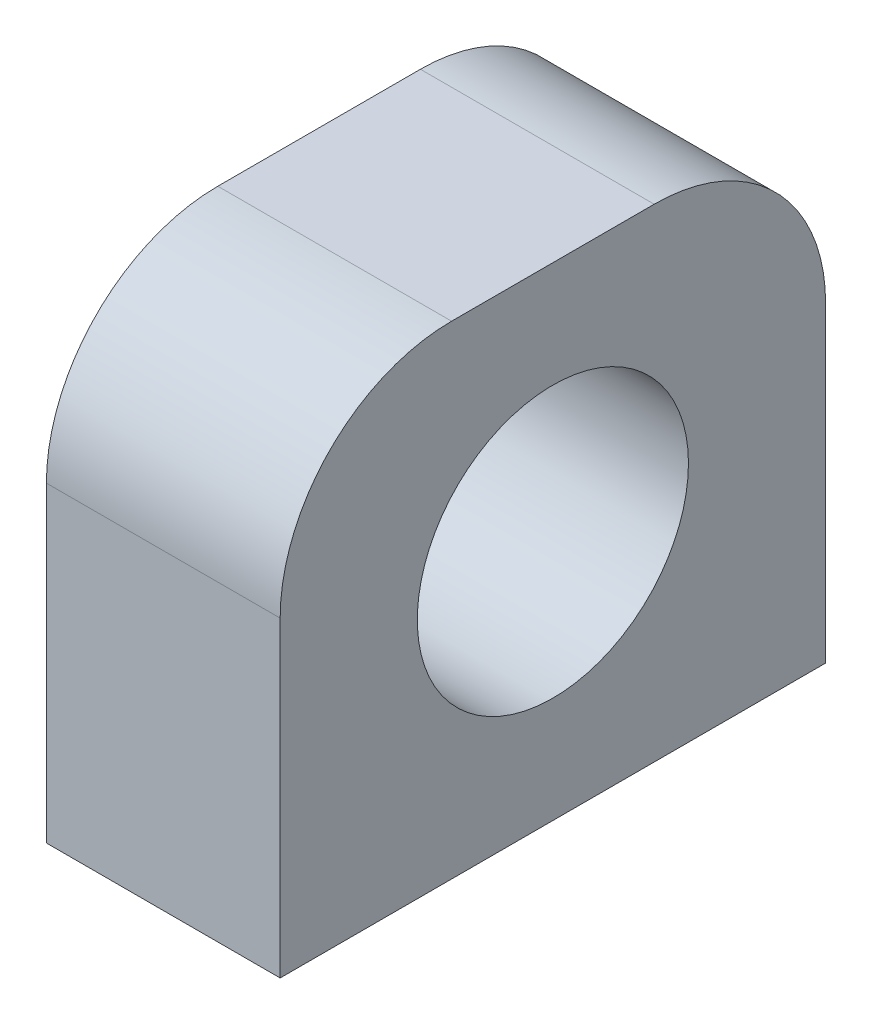
ISO-10303-21;
HEADER;
FILE_DESCRIPTION(('STEP AP214'),'2;1');
FILE_NAME('part.step','',(''),(''),'','','');
FILE_SCHEMA(('AUTOMOTIVE_DESIGN { 1 0 10303 214 1 1 1 1 }'));
ENDSEC;
DATA;
#1=APPLICATION_CONTEXT('core data for automotive mechanical design processes');
#2=APPLICATION_PROTOCOL_DEFINITION('international standard','automotive_design',2000,#1);
#3=PRODUCT_CONTEXT('',#1,'mechanical');
#4=PRODUCT('Part','Part','',(#3));
#5=PRODUCT_RELATED_PRODUCT_CATEGORY('part','',(#4));
#6=PRODUCT_DEFINITION_FORMATION('','',#4);
#7=PRODUCT_DEFINITION_CONTEXT('part definition',#1,'design');
#8=PRODUCT_DEFINITION('design','',#6,#7);
#9=PRODUCT_DEFINITION_SHAPE('','',#8);
#10=(LENGTH_UNIT() NAMED_UNIT(*) SI_UNIT(.MILLI.,.METRE.));
#11=(NAMED_UNIT(*) PLANE_ANGLE_UNIT() SI_UNIT($,.RADIAN.));
#12=(NAMED_UNIT(*) SI_UNIT($,.STERADIAN.) SOLID_ANGLE_UNIT());
#13=UNCERTAINTY_MEASURE_WITH_UNIT(LENGTH_MEASURE(1.E-05),#10,'distance_accuracy_value','');
#14=(GEOMETRIC_REPRESENTATION_CONTEXT(3) GLOBAL_UNCERTAINTY_ASSIGNED_CONTEXT((#13)) GLOBAL_UNIT_ASSIGNED_CONTEXT((#10,
#11,#12)) REPRESENTATION_CONTEXT('',''));
#15=CARTESIAN_POINT('',(0.,0.,0.));
#16=DIRECTION('',(0.,0.,1.));
#17=DIRECTION('',(1.,0.,0.));
#18=AXIS2_PLACEMENT_3D('',#15,#16,#17);
#19=CARTESIAN_POINT('',(19.05,-19.685,-22.225));
#20=DIRECTION('',(0.,0.,1.));
#21=DIRECTION('',(1.,0.,0.));
#22=AXIS2_PLACEMENT_3D('',#19,#20,#21);
#23=PLANE('',#22);
#24=DIRECTION('',(0.,1.,0.));
#25=VECTOR('',#24,1.);
#26=CARTESIAN_POINT('',(0.,-19.685,-22.225));
#27=LINE('',#26,#25);
#28=CARTESIAN_POINT('',(0.,-19.685,-22.225));
#29=VERTEX_POINT('',#28);
#30=CARTESIAN_POINT('',(0.,5.715,-22.225));
#31=VERTEX_POINT('',#30);
#32=EDGE_CURVE('E115',#29,#31,#27,.T.);
#33=ORIENTED_EDGE('',*,*,#32,.T.);
#34=DIRECTION('',(-1.,0.,0.));
#35=VECTOR('',#34,1.);
#36=CARTESIAN_POINT('',(19.05,5.715,-22.225));
#37=LINE('',#36,#35);
#38=CARTESIAN_POINT('',(19.05,5.715,-22.225));
#39=VERTEX_POINT('',#38);
#40=EDGE_CURVE('E11',#31,#39,#37,.F.);
#41=ORIENTED_EDGE('',*,*,#40,.T.);
#42=DIRECTION('',(0.,1.,0.));
#43=VECTOR('',#42,1.);
#44=CARTESIAN_POINT('',(19.05,-19.685,-22.225));
#45=LINE('',#44,#43);
#46=CARTESIAN_POINT('',(19.05,-19.685,-22.225));
#47=VERTEX_POINT('',#46);
#48=EDGE_CURVE('E122',#47,#39,#45,.T.);
#49=ORIENTED_EDGE('',*,*,#48,.F.);
#50=DIRECTION('',(-1.,0.,0.));
#51=VECTOR('',#50,1.);
#52=CARTESIAN_POINT('',(19.05,-19.685,-22.225));
#53=LINE('',#52,#51);
#54=EDGE_CURVE('E107',#47,#29,#53,.T.);
#55=ORIENTED_EDGE('',*,*,#54,.T.);
#56=EDGE_LOOP('',(#33,#41,#49,#55));
#57=FACE_BOUND('',#56,.T.);
#58=ADVANCED_FACE('F33',(#57),#23,.F.);
#59=CARTESIAN_POINT('',(19.05,19.685,22.225));
#60=DIRECTION('',(0.,-1.,0.));
#61=DIRECTION('',(0.,0.,-1.));
#62=AXIS2_PLACEMENT_3D('',#59,#60,#61);
#63=PLANE('',#62);
#64=DIRECTION('',(0.,0.,1.));
#65=VECTOR('',#64,1.);
#66=CARTESIAN_POINT('',(0.,19.685,22.225));
#67=LINE('',#66,#65);
#68=CARTESIAN_POINT('',(0.,19.685,-8.255));
#69=VERTEX_POINT('',#68);
#70=CARTESIAN_POINT('',(0.,19.685,8.255));
#71=VERTEX_POINT('',#70);
#72=EDGE_CURVE('E117',#69,#71,#67,.T.);
#73=ORIENTED_EDGE('',*,*,#72,.T.);
#74=DIRECTION('',(-1.,0.,0.));
#75=VECTOR('',#74,1.);
#76=CARTESIAN_POINT('',(19.05,19.685,8.255));
#77=LINE('',#76,#75);
#78=CARTESIAN_POINT('',(19.05,19.685,8.255));
#79=VERTEX_POINT('',#78);
#80=EDGE_CURVE('E54',#71,#79,#77,.F.);
#81=ORIENTED_EDGE('',*,*,#80,.T.);
#82=DIRECTION('',(0.,0.,1.));
#83=VECTOR('',#82,1.);
#84=CARTESIAN_POINT('',(19.05,19.685,22.225));
#85=LINE('',#84,#83);
#86=CARTESIAN_POINT('',(19.05,19.685,-8.255));
#87=VERTEX_POINT('',#86);
#88=EDGE_CURVE('E97',#87,#79,#85,.T.);
#89=ORIENTED_EDGE('',*,*,#88,.F.);
#90=DIRECTION('',(-1.,0.,0.));
#91=VECTOR('',#90,1.);
#92=CARTESIAN_POINT('',(19.05,19.685,-8.255));
#93=LINE('',#92,#91);
#94=EDGE_CURVE('E129',#87,#69,#93,.T.);
#95=ORIENTED_EDGE('',*,*,#94,.T.);
#96=EDGE_LOOP('',(#73,#81,#89,#95));
#97=FACE_BOUND('',#96,.T.);
#98=ADVANCED_FACE('F137',(#97),#63,.F.);
#99=CARTESIAN_POINT('',(19.05,-19.685,22.225));
#100=DIRECTION('',(0.,0.,-1.));
#101=DIRECTION('',(-1.,0.,0.));
#102=AXIS2_PLACEMENT_3D('',#99,#100,#101);
#103=PLANE('',#102);
#104=DIRECTION('',(0.,-1.,0.));
#105=VECTOR('',#104,1.);
#106=CARTESIAN_POINT('',(19.05,-19.685,22.225));
#107=LINE('',#106,#105);
#108=CARTESIAN_POINT('',(19.05,5.715,22.225));
#109=VERTEX_POINT('',#108);
#110=CARTESIAN_POINT('',(19.05,-19.685,22.225));
#111=VERTEX_POINT('',#110);
#112=EDGE_CURVE('E87',#109,#111,#107,.T.);
#113=ORIENTED_EDGE('',*,*,#112,.F.);
#114=DIRECTION('',(-1.,0.,0.));
#115=VECTOR('',#114,1.);
#116=CARTESIAN_POINT('',(19.05,5.715,22.225));
#117=LINE('',#116,#115);
#118=CARTESIAN_POINT('',(0.,5.715,22.225));
#119=VERTEX_POINT('',#118);
#120=EDGE_CURVE('E106',#109,#119,#117,.T.);
#121=ORIENTED_EDGE('',*,*,#120,.T.);
#122=DIRECTION('',(0.,-1.,0.));
#123=VECTOR('',#122,1.);
#124=CARTESIAN_POINT('',(0.,-19.685,22.225));
#125=LINE('',#124,#123);
#126=CARTESIAN_POINT('',(0.,-19.685,22.225));
#127=VERTEX_POINT('',#126);
#128=EDGE_CURVE('E103',#119,#127,#125,.T.);
#129=ORIENTED_EDGE('',*,*,#128,.T.);
#130=DIRECTION('',(-1.,0.,0.));
#131=VECTOR('',#130,1.);
#132=CARTESIAN_POINT('',(19.05,-19.685,22.225));
#133=LINE('',#132,#131);
#134=EDGE_CURVE('E100',#111,#127,#133,.T.);
#135=ORIENTED_EDGE('',*,*,#134,.F.);
#136=EDGE_LOOP('',(#113,#121,#129,#135));
#137=FACE_BOUND('',#136,.T.);
#138=ADVANCED_FACE('F101',(#137),#103,.F.);
#139=CARTESIAN_POINT('',(19.05,-19.685,22.225));
#140=DIRECTION('',(0.,1.,0.));
#141=DIRECTION('',(0.,0.,1.));
#142=AXIS2_PLACEMENT_3D('',#139,#140,#141);
#143=PLANE('',#142);
#144=DIRECTION('',(0.,0.,-1.));
#145=VECTOR('',#144,1.);
#146=CARTESIAN_POINT('',(0.,-19.685,22.225));
#147=LINE('',#146,#145);
#148=EDGE_CURVE('E121',#127,#29,#147,.T.);
#149=ORIENTED_EDGE('',*,*,#148,.T.);
#150=ORIENTED_EDGE('',*,*,#54,.F.);
#151=DIRECTION('',(0.,0.,-1.));
#152=VECTOR('',#151,1.);
#153=CARTESIAN_POINT('',(19.05,-19.685,22.225));
#154=LINE('',#153,#152);
#155=EDGE_CURVE('E91',#111,#47,#154,.T.);
#156=ORIENTED_EDGE('',*,*,#155,.F.);
#157=ORIENTED_EDGE('',*,*,#134,.T.);
#158=EDGE_LOOP('',(#149,#150,#156,#157));
#159=FACE_BOUND('',#158,.T.);
#160=ADVANCED_FACE('F109',(#159),#143,.F.);
#161=CARTESIAN_POINT('',(19.05,0.,0.));
#162=DIRECTION('',(-1.,0.,0.));
#163=DIRECTION('',(0.,0.,1.));
#164=AXIS2_PLACEMENT_3D('',#161,#162,#163);
#165=PLANE('',#164);
#166=CARTESIAN_POINT('',(19.05,0.,0.));
#167=DIRECTION('',(1.,0.,0.));
#168=DIRECTION('',(0.,0.,-1.));
#169=AXIS2_PLACEMENT_3D('',#166,#167,#168);
#170=CIRCLE('',#169,11.049);
#171=CARTESIAN_POINT('',(19.05,0.,-11.049));
#172=VERTEX_POINT('',#171);
#173=EDGE_CURVE('E144',#172,#172,#170,.T.);
#174=ORIENTED_EDGE('',*,*,#173,.F.);
#175=EDGE_LOOP('',(#174));
#176=FACE_BOUND('',#175,.T.);
#177=ORIENTED_EDGE('',*,*,#88,.T.);
#178=CARTESIAN_POINT('',(19.05,5.715,8.255));
#179=DIRECTION('',(-1.,0.,0.));
#180=DIRECTION('',(0.,0.,1.));
#181=AXIS2_PLACEMENT_3D('',#178,#179,#180);
#182=CIRCLE('',#181,13.97);
#183=EDGE_CURVE('E41',#79,#109,#182,.F.);
#184=ORIENTED_EDGE('',*,*,#183,.T.);
#185=ORIENTED_EDGE('',*,*,#112,.T.);
#186=ORIENTED_EDGE('',*,*,#155,.T.);
#187=ORIENTED_EDGE('',*,*,#48,.T.);
#188=CARTESIAN_POINT('',(19.05,5.715,-8.255));
#189=DIRECTION('',(-1.,0.,0.));
#190=DIRECTION('',(0.,0.,1.));
#191=AXIS2_PLACEMENT_3D('',#188,#189,#190);
#192=CIRCLE('',#191,13.97);
#193=EDGE_CURVE('E133',#39,#87,#192,.F.);
#194=ORIENTED_EDGE('',*,*,#193,.T.);
#195=EDGE_LOOP('',(#177,#184,#185,#186,#187,#194));
#196=FACE_BOUND('',#195,.T.);
#197=ADVANCED_FACE('F89',(#176,#196),#165,.F.);
#198=CARTESIAN_POINT('',(0.,0.,0.));
#199=DIRECTION('',(-1.,0.,0.));
#200=DIRECTION('',(0.,0.,1.));
#201=AXIS2_PLACEMENT_3D('',#198,#199,#200);
#202=PLANE('',#201);
#203=CARTESIAN_POINT('',(0.,0.,0.));
#204=DIRECTION('',(1.,0.,0.));
#205=DIRECTION('',(0.,0.,-1.));
#206=AXIS2_PLACEMENT_3D('',#203,#204,#205);
#207=CIRCLE('',#206,11.049);
#208=CARTESIAN_POINT('',(0.,0.,-11.049));
#209=VERTEX_POINT('',#208);
#210=EDGE_CURVE('E118',#209,#209,#207,.T.);
#211=ORIENTED_EDGE('',*,*,#210,.T.);
#212=EDGE_LOOP('',(#211));
#213=FACE_BOUND('',#212,.T.);
#214=ORIENTED_EDGE('',*,*,#128,.F.);
#215=CARTESIAN_POINT('',(0.,5.715,8.255));
#216=DIRECTION('',(-1.,0.,0.));
#217=DIRECTION('',(0.,0.,1.));
#218=AXIS2_PLACEMENT_3D('',#215,#216,#217);
#219=CIRCLE('',#218,13.97);
#220=EDGE_CURVE('E127',#119,#71,#219,.T.);
#221=ORIENTED_EDGE('',*,*,#220,.T.);
#222=ORIENTED_EDGE('',*,*,#72,.F.);
#223=CARTESIAN_POINT('',(0.,5.715,-8.255));
#224=DIRECTION('',(-1.,0.,0.));
#225=DIRECTION('',(0.,0.,1.));
#226=AXIS2_PLACEMENT_3D('',#223,#224,#225);
#227=CIRCLE('',#226,13.97);
#228=EDGE_CURVE('E125',#69,#31,#227,.T.);
#229=ORIENTED_EDGE('',*,*,#228,.T.);
#230=ORIENTED_EDGE('',*,*,#32,.F.);
#231=ORIENTED_EDGE('',*,*,#148,.F.);
#232=EDGE_LOOP('',(#214,#221,#222,#229,#230,#231));
#233=FACE_BOUND('',#232,.T.);
#234=ADVANCED_FACE('F141',(#213,#233),#202,.T.);
#235=CARTESIAN_POINT('',(0.,0.,0.));
#236=DIRECTION('',(1.,0.,0.));
#237=DIRECTION('',(0.,0.,-1.));
#238=AXIS2_PLACEMENT_3D('',#235,#236,#237);
#239=CYLINDRICAL_SURFACE('',#238,11.049);
#240=CARTESIAN_POINT('',(0.,0.,-11.049));
#241=CARTESIAN_POINT('',(0.1984375,0.,-11.049));
#242=CARTESIAN_POINT('',(0.396875,0.,-11.049));
#243=CARTESIAN_POINT('',(0.79375,0.,-11.049));
#244=CARTESIAN_POINT('',(0.9921875,0.,-11.049));
#245=CARTESIAN_POINT('',(1.3890625,0.,-11.049));
#246=CARTESIAN_POINT('',(1.5875,0.,-11.049));
#247=CARTESIAN_POINT('',(1.984375,0.,-11.049));
#248=CARTESIAN_POINT('',(2.1828125,0.,-11.049));
#249=CARTESIAN_POINT('',(2.5796875,0.,-11.049));
#250=CARTESIAN_POINT('',(2.778125,0.,-11.049));
#251=CARTESIAN_POINT('',(3.175,0.,-11.049));
#252=CARTESIAN_POINT('',(3.3734375,0.,-11.049));
#253=CARTESIAN_POINT('',(3.7703125,0.,-11.049));
#254=CARTESIAN_POINT('',(3.96875,0.,-11.049));
#255=CARTESIAN_POINT('',(4.365625,0.,-11.049));
#256=CARTESIAN_POINT('',(4.5640625,0.,-11.049));
#257=CARTESIAN_POINT('',(4.9609375,0.,-11.049));
#258=CARTESIAN_POINT('',(5.159375,0.,-11.049));
#259=CARTESIAN_POINT('',(5.55625,0.,-11.049));
#260=CARTESIAN_POINT('',(5.7546875,0.,-11.049));
#261=CARTESIAN_POINT('',(6.1515625,0.,-11.049));
#262=CARTESIAN_POINT('',(6.35,0.,-11.049));
#263=CARTESIAN_POINT('',(6.746875,0.,-11.049));
#264=CARTESIAN_POINT('',(6.9453125,0.,-11.049));
#265=CARTESIAN_POINT('',(7.3421875,0.,-11.049));
#266=CARTESIAN_POINT('',(7.540625,0.,-11.049));
#267=CARTESIAN_POINT('',(7.9375,0.,-11.049));
#268=CARTESIAN_POINT('',(8.1359375,0.,-11.049));
#269=CARTESIAN_POINT('',(8.5328125,0.,-11.049));
#270=CARTESIAN_POINT('',(8.73125,0.,-11.049));
#271=CARTESIAN_POINT('',(9.128125,0.,-11.049));
#272=CARTESIAN_POINT('',(9.3265625,0.,-11.049));
#273=CARTESIAN_POINT('',(9.7234375,0.,-11.049));
#274=CARTESIAN_POINT('',(9.921875,0.,-11.049));
#275=CARTESIAN_POINT('',(10.31875,0.,-11.049));
#276=CARTESIAN_POINT('',(10.5171875,0.,-11.049));
#277=CARTESIAN_POINT('',(10.9140625,0.,-11.049));
#278=CARTESIAN_POINT('',(11.1125,0.,-11.049));
#279=CARTESIAN_POINT('',(11.509375,0.,-11.049));
#280=CARTESIAN_POINT('',(11.7078125,0.,-11.049));
#281=CARTESIAN_POINT('',(12.1046875,0.,-11.049));
#282=CARTESIAN_POINT('',(12.303125,0.,-11.049));
#283=CARTESIAN_POINT('',(12.7,0.,-11.049));
#284=CARTESIAN_POINT('',(12.8984375,0.,-11.049));
#285=CARTESIAN_POINT('',(13.2953125,0.,-11.049));
#286=CARTESIAN_POINT('',(13.49375,0.,-11.049));
#287=CARTESIAN_POINT('',(13.890625,0.,-11.049));
#288=CARTESIAN_POINT('',(14.0890625,0.,-11.049));
#289=CARTESIAN_POINT('',(14.4859375,0.,-11.049));
#290=CARTESIAN_POINT('',(14.684375,0.,-11.049));
#291=CARTESIAN_POINT('',(15.08125,0.,-11.049));
#292=CARTESIAN_POINT('',(15.2796875,0.,-11.049));
#293=CARTESIAN_POINT('',(15.6765625,0.,-11.049));
#294=CARTESIAN_POINT('',(15.875,0.,-11.049));
#295=CARTESIAN_POINT('',(16.271875,0.,-11.049));
#296=CARTESIAN_POINT('',(16.4703125,0.,-11.049));
#297=CARTESIAN_POINT('',(16.8671875,0.,-11.049));
#298=CARTESIAN_POINT('',(17.065625,0.,-11.049));
#299=CARTESIAN_POINT('',(17.4625,0.,-11.049));
#300=CARTESIAN_POINT('',(17.6609375,0.,-11.049));
#301=CARTESIAN_POINT('',(18.0578125,0.,-11.049));
#302=CARTESIAN_POINT('',(18.25625,0.,-11.049));
#303=CARTESIAN_POINT('',(18.653125,0.,-11.049));
#304=CARTESIAN_POINT('',(18.8515625,0.,-11.049));
#305=CARTESIAN_POINT('',(19.05,0.,-11.049));
#306=B_SPLINE_CURVE_WITH_KNOTS('',3,(#240,#241,#242,#243,#244,#245,#246,#247,#248,#249,#250,
#251,#252,#253,#254,#255,#256,#257,#258,#259,#260,#261,#262,#263,#264,#265,#266,#267,#268,#269,
#270,#271,#272,#273,#274,#275,#276,#277,#278,#279,#280,#281,#282,#283,#284,#285,#286,#287,#288,
#289,#290,#291,#292,#293,#294,#295,#296,#297,#298,#299,#300,#301,#302,#303,#304,#305),
.UNSPECIFIED.,.F.,.F.,(4,2,2,2,2,2,2,2,2,2,2,2,2,2,2,2,2,2,2,2,2,2,2,2,2,2,2,2,2,2,2,2,4),(0.,
0.5953125,1.190625,1.7859375,2.38125,2.9765625,3.571875,4.1671875,4.7625,5.3578125,5.953125,
6.5484375,7.14375,7.7390625,8.334375,8.9296875,9.525,10.1203125,10.715625,11.3109375,11.90625,
12.5015625,13.096875,13.6921875,14.2875,14.8828125,15.478125,16.0734375,16.66875,17.2640625,
17.859375,18.4546875,19.05),.UNSPECIFIED.);
#307=EDGE_CURVE('BSEAM151',#209,#172,#306,.T.);
#308=ORIENTED_EDGE('',*,*,#210,.F.);
#309=ORIENTED_EDGE('',*,*,#173,.T.);
#310=ORIENTED_EDGE('',*,*,#307,.T.);
#311=ORIENTED_EDGE('',*,*,#307,.F.);
#312=EDGE_LOOP('',(#308,#310,#309,#311));
#313=FACE_BOUND('',#312,.T.);
#314=ADVANCED_FACE('F151',(#313),#239,.F.);
#315=CARTESIAN_POINT('',(19.05,5.715,8.255));
#316=DIRECTION('',(-1.,0.,0.));
#317=DIRECTION('',(0.,0.,1.));
#318=AXIS2_PLACEMENT_3D('',#315,#316,#317);
#319=CYLINDRICAL_SURFACE('',#318,13.97);
#320=ORIENTED_EDGE('',*,*,#183,.F.);
#321=ORIENTED_EDGE('',*,*,#80,.F.);
#322=ORIENTED_EDGE('',*,*,#220,.F.);
#323=ORIENTED_EDGE('',*,*,#120,.F.);
#324=EDGE_LOOP('',(#320,#321,#322,#323));
#325=FACE_BOUND('',#324,.T.);
#326=ADVANCED_FACE('F154',(#325),#319,.T.);
#327=CARTESIAN_POINT('',(19.05,5.715,-8.255));
#328=DIRECTION('',(-1.,0.,0.));
#329=DIRECTION('',(0.,0.,1.));
#330=AXIS2_PLACEMENT_3D('',#327,#328,#329);
#331=CYLINDRICAL_SURFACE('',#330,13.97);
#332=ORIENTED_EDGE('',*,*,#193,.F.);
#333=ORIENTED_EDGE('',*,*,#40,.F.);
#334=ORIENTED_EDGE('',*,*,#228,.F.);
#335=ORIENTED_EDGE('',*,*,#94,.F.);
#336=EDGE_LOOP('',(#332,#333,#334,#335));
#337=FACE_BOUND('',#336,.T.);
#338=ADVANCED_FACE('F35',(#337),#331,.T.);
#339=CLOSED_SHELL('',(#58,#98,#138,#160,#197,#234,#314,#326,#338));
#340=MANIFOLD_SOLID_BREP('B2',#339);
#341=ADVANCED_BREP_SHAPE_REPRESENTATION('',(#18,#340),#14);
#342=SHAPE_DEFINITION_REPRESENTATION(#9,#341);
ENDSEC;
END-ISO-10303-21;
